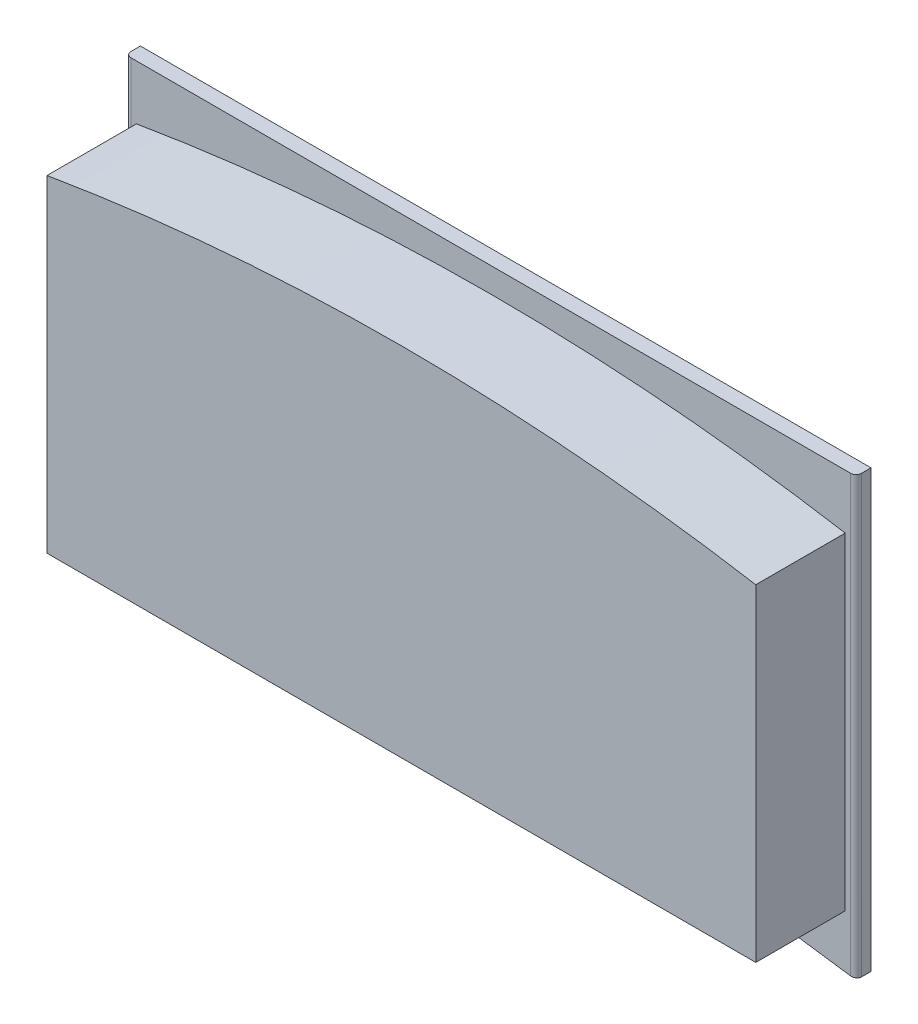
ISO-10303-21;
HEADER;
FILE_DESCRIPTION(('STEP AP214'),'2;1');
FILE_NAME('part.step','',(''),(''),'','','');
FILE_SCHEMA(('AUTOMOTIVE_DESIGN { 1 0 10303 214 1 1 1 1 }'));
ENDSEC;
DATA;
#1=APPLICATION_CONTEXT('core data for automotive mechanical design processes');
#2=APPLICATION_PROTOCOL_DEFINITION('international standard','automotive_design',2000,#1);
#3=PRODUCT_CONTEXT('',#1,'mechanical');
#4=PRODUCT('Part','Part','',(#3));
#5=PRODUCT_RELATED_PRODUCT_CATEGORY('part','',(#4));
#6=PRODUCT_DEFINITION_FORMATION('','',#4);
#7=PRODUCT_DEFINITION_CONTEXT('part definition',#1,'design');
#8=PRODUCT_DEFINITION('design','',#6,#7);
#9=PRODUCT_DEFINITION_SHAPE('','',#8);
#10=(LENGTH_UNIT() NAMED_UNIT(*) SI_UNIT(.MILLI.,.METRE.));
#11=(NAMED_UNIT(*) PLANE_ANGLE_UNIT() SI_UNIT($,.RADIAN.));
#12=(NAMED_UNIT(*) SI_UNIT($,.STERADIAN.) SOLID_ANGLE_UNIT());
#13=UNCERTAINTY_MEASURE_WITH_UNIT(LENGTH_MEASURE(1.E-05),#10,'distance_accuracy_value','');
#14=(GEOMETRIC_REPRESENTATION_CONTEXT(3) GLOBAL_UNCERTAINTY_ASSIGNED_CONTEXT((#13)) GLOBAL_UNIT_ASSIGNED_CONTEXT((#10,
#11,#12)) REPRESENTATION_CONTEXT('',''));
#15=CARTESIAN_POINT('',(0.,0.,0.));
#16=DIRECTION('',(0.,0.,1.));
#17=DIRECTION('',(1.,0.,0.));
#18=AXIS2_PLACEMENT_3D('',#15,#16,#17);
#19=CARTESIAN_POINT('',(-33.5,20.,1.36666666666667));
#20=DIRECTION('',(0.,-1.,0.));
#21=DIRECTION('',(1.,0.,0.));
#22=AXIS2_PLACEMENT_3D('',#19,#20,#21);
#23=PLANE('',#22);
#24=DIRECTION('',(-1.,0.,0.));
#25=VECTOR('',#24,1.);
#26=CARTESIAN_POINT('',(-33.5,20.,1.36666666666667));
#27=LINE('',#26,#25);
#28=CARTESIAN_POINT('',(33.,20.,1.36666666666667));
#29=VERTEX_POINT('',#28);
#30=CARTESIAN_POINT('',(-33.,20.,1.36666666666667));
#31=VERTEX_POINT('',#30);
#32=EDGE_CURVE('E157',#29,#31,#27,.T.);
#33=ORIENTED_EDGE('',*,*,#32,.F.);
#34=CARTESIAN_POINT('',(33.,20.,0.866666666666666));
#35=DIRECTION('',(0.,-1.,0.));
#36=DIRECTION('',(1.,0.,0.));
#37=AXIS2_PLACEMENT_3D('',#34,#35,#36);
#38=CIRCLE('',#37,0.5);
#39=CARTESIAN_POINT('',(33.5,20.,0.866666666666666));
#40=VERTEX_POINT('',#39);
#41=EDGE_CURVE('E190',#29,#40,#38,.F.);
#42=ORIENTED_EDGE('',*,*,#41,.T.);
#43=DIRECTION('',(0.,0.,-1.));
#44=VECTOR('',#43,1.);
#45=CARTESIAN_POINT('',(33.5,20.,1.36666666666667));
#46=LINE('',#45,#44);
#47=CARTESIAN_POINT('',(33.5,20.,0.));
#48=VERTEX_POINT('',#47);
#49=EDGE_CURVE('E164',#40,#48,#46,.T.);
#50=ORIENTED_EDGE('',*,*,#49,.T.);
#51=DIRECTION('',(-1.,0.,0.));
#52=VECTOR('',#51,1.);
#53=CARTESIAN_POINT('',(-33.5,20.,0.));
#54=LINE('',#53,#52);
#55=CARTESIAN_POINT('',(-33.5,20.,0.));
#56=VERTEX_POINT('',#55);
#57=EDGE_CURVE('E153',#48,#56,#54,.T.);
#58=ORIENTED_EDGE('',*,*,#57,.T.);
#59=DIRECTION('',(0.,0.,-1.));
#60=VECTOR('',#59,1.);
#61=CARTESIAN_POINT('',(-33.5,20.,1.36666666666667));
#62=LINE('',#61,#60);
#63=CARTESIAN_POINT('',(-33.5,20.,0.866666666666666));
#64=VERTEX_POINT('',#63);
#65=EDGE_CURVE('E180',#64,#56,#62,.T.);
#66=ORIENTED_EDGE('',*,*,#65,.F.);
#67=CARTESIAN_POINT('',(-33.,20.,0.866666666666666));
#68=DIRECTION('',(0.,-1.,0.));
#69=DIRECTION('',(1.,0.,0.));
#70=AXIS2_PLACEMENT_3D('',#67,#68,#69);
#71=CIRCLE('',#70,0.5);
#72=EDGE_CURVE('E188',#64,#31,#71,.F.);
#73=ORIENTED_EDGE('',*,*,#72,.T.);
#74=EDGE_LOOP('',(#33,#42,#50,#58,#66,#73));
#75=FACE_BOUND('',#74,.T.);
#76=ADVANCED_FACE('F36',(#75),#23,.F.);
#77=CARTESIAN_POINT('',(-33.5,20.,1.36666666666667));
#78=DIRECTION('',(1.,0.,0.));
#79=DIRECTION('',(0.,0.,-1.));
#80=AXIS2_PLACEMENT_3D('',#77,#78,#79);
#81=PLANE('',#80);
#82=DIRECTION('',(0.,0.,-1.));
#83=VECTOR('',#82,1.);
#84=CARTESIAN_POINT('',(-33.5,-20.,1.36666666666667));
#85=LINE('',#84,#83);
#86=CARTESIAN_POINT('',(-33.5,-20.,0.866666666666666));
#87=VERTEX_POINT('',#86);
#88=CARTESIAN_POINT('',(-33.5,-20.,0.));
#89=VERTEX_POINT('',#88);
#90=EDGE_CURVE('E178',#87,#89,#85,.T.);
#91=ORIENTED_EDGE('',*,*,#90,.F.);
#92=DIRECTION('',(0.,-1.,0.));
#93=VECTOR('',#92,1.);
#94=CARTESIAN_POINT('',(-33.5,20.,0.866666666666666));
#95=LINE('',#94,#93);
#96=EDGE_CURVE('E11',#87,#64,#95,.F.);
#97=ORIENTED_EDGE('',*,*,#96,.T.);
#98=ORIENTED_EDGE('',*,*,#65,.T.);
#99=DIRECTION('',(0.,-1.,0.));
#100=VECTOR('',#99,1.);
#101=CARTESIAN_POINT('',(-33.5,20.,0.));
#102=LINE('',#101,#100);
#103=EDGE_CURVE('E167',#56,#89,#102,.T.);
#104=ORIENTED_EDGE('',*,*,#103,.T.);
#105=EDGE_LOOP('',(#91,#97,#98,#104));
#106=FACE_BOUND('',#105,.T.);
#107=ADVANCED_FACE('F208',(#106),#81,.F.);
#108=CARTESIAN_POINT('',(0.,-237.434472887811,1.36666666666667));
#109=DIRECTION('',(0.,0.,-1.));
#110=DIRECTION('',(-1.,0.,0.));
#111=AXIS2_PLACEMENT_3D('',#108,#109,#110);
#112=CYLINDRICAL_SURFACE('',#111,220.);
#113=DIRECTION('',(0.,0.,-1.));
#114=VECTOR('',#113,1.);
#115=CARTESIAN_POINT('',(33.5,-20.,1.36666666666667));
#116=LINE('',#115,#114);
#117=CARTESIAN_POINT('',(33.5,-20.,0.866666666666666));
#118=VERTEX_POINT('',#117);
#119=CARTESIAN_POINT('',(33.5,-20.,0.));
#120=VERTEX_POINT('',#119);
#121=EDGE_CURVE('E176',#118,#120,#116,.T.);
#122=ORIENTED_EDGE('',*,*,#121,.F.);
#123=CARTESIAN_POINT('',(33.5,-20.,0.866666666666666));
#124=CARTESIAN_POINT('',(33.5000249589342,-20.0000039983039,0.894559501230496));
#125=CARTESIAN_POINT('',(33.4976675189293,-19.9996406382553,0.922443224294343));
#126=CARTESIAN_POINT('',(33.4883743582185,-19.9982090712921,0.977387654689915));
#127=CARTESIAN_POINT('',(33.4814437639934,-19.9971416536227,1.00444924813315));
#128=CARTESIAN_POINT('',(33.4631867227172,-19.9943312069324,1.05702010123214));
#129=CARTESIAN_POINT('',(33.4518586734638,-19.9925879316648,1.08252879116795));
#130=CARTESIAN_POINT('',(33.4251543111297,-19.9884813352237,1.13127121627492));
#131=CARTESIAN_POINT('',(33.409778328648,-19.986118064686,1.15450513701647));
#132=CARTESIAN_POINT('',(33.3753369398772,-19.9808291197986,1.19817788515446));
#133=CARTESIAN_POINT('',(33.3562529389205,-19.9779006114528,1.2186016999275));
#134=CARTESIAN_POINT('',(33.3149948089183,-19.9715759244639,1.25596470136937));
#135=CARTESIAN_POINT('',(33.2928200125786,-19.9681796448321,1.27290313359282));
#136=CARTESIAN_POINT('',(33.2457501480285,-19.960978710694,1.30301092808374));
#137=CARTESIAN_POINT('',(33.2208274583397,-19.957169917977,1.31613607129277));
#138=CARTESIAN_POINT('',(33.1691751892543,-19.9492860398946,1.33801099754405));
#139=CARTESIAN_POINT('',(33.142446387359,-19.9452110691394,1.34676264985061));
#140=CARTESIAN_POINT('',(33.0963234287435,-19.938188458615,1.35768469532813));
#141=CARTESIAN_POINT('',(33.0771976169219,-19.9352789292024,1.36105082261237));
#142=CARTESIAN_POINT('',(33.0387170847825,-19.9294302887209,1.36554168183552));
#143=CARTESIAN_POINT('',(33.0193627248747,-19.9264912250965,1.36666956449085));
#144=CARTESIAN_POINT('',(33.,-19.9235536216734,1.36666666666667));
#145=B_SPLINE_CURVE_WITH_KNOTS('',3,(#123,#124,#125,#126,#127,#128,#129,#130,#131,#132,#133,
#134,#135,#136,#137,#138,#139,#140,#141,#142,#143,#144),.UNSPECIFIED.,.F.,.F.,(4,2,2,2,2,2,2,2,
2,2,4),(0.,0.083563267422854,0.167033019658852,0.250533212487111,0.334026587877431,
0.417950000129661,0.501891559365854,0.586770850201522,0.671613831868495,0.730401438894563,
0.789106233328437),.UNSPECIFIED.);
#146=CARTESIAN_POINT('',(33.,-19.9235536216734,1.36666666666667));
#147=VERTEX_POINT('',#146);
#148=EDGE_CURVE('E45',#118,#147,#145,.T.);
#149=ORIENTED_EDGE('',*,*,#148,.T.);
#150=CARTESIAN_POINT('',(0.,-237.434472887811,1.36666666666667));
#151=DIRECTION('',(0.,0.,-1.));
#152=DIRECTION('',(-1.,0.,0.));
#153=AXIS2_PLACEMENT_3D('',#150,#151,#152);
#154=CIRCLE('',#153,220.);
#155=CARTESIAN_POINT('',(-33.,-19.9235536216734,1.36666666666667));
#156=VERTEX_POINT('',#155);
#157=EDGE_CURVE('E160',#156,#147,#154,.T.);
#158=ORIENTED_EDGE('',*,*,#157,.F.);
#159=CARTESIAN_POINT('',(-33.,-19.9235536216734,1.36666666666667));
#160=CARTESIAN_POINT('',(-33.0283709651002,-19.9278577468027,1.36668941570464));
#161=CARTESIAN_POINT('',(-33.0567356810366,-19.9321670343335,1.36425323953006));
#162=CARTESIAN_POINT('',(-33.1126518710774,-19.9406728380225,1.35462961715823));
#163=CARTESIAN_POINT('',(-33.1402037108191,-19.9448694048048,1.34744434225504));
#164=CARTESIAN_POINT('',(-33.1937364425937,-19.9530332153752,1.32848327075606));
#165=CARTESIAN_POINT('',(-33.2197164049979,-19.9570003233985,1.31670478774747));
#166=CARTESIAN_POINT('',(-33.2693320886797,-19.9645849240657,1.28888514266402));
#167=CARTESIAN_POINT('',(-33.2929684311854,-19.9682025093518,1.27284511437626));
#168=CARTESIAN_POINT('',(-33.3370957833991,-19.9749627671614,1.23703126666132));
#169=CARTESIAN_POINT('',(-33.3576021584496,-19.9781077584357,1.21727682483244));
#170=CARTESIAN_POINT('',(-33.3950053501275,-19.9838486610631,1.17452589880443));
#171=CARTESIAN_POINT('',(-33.4119015508058,-19.9864444787184,1.15152886247986));
#172=CARTESIAN_POINT('',(-33.441403532767,-19.9909796510911,1.10321651383583));
#173=CARTESIAN_POINT('',(-33.4540534138775,-19.9929257521586,1.07792873073053));
#174=CARTESIAN_POINT('',(-33.4749187659059,-19.9961369718641,1.02555415491055));
#175=CARTESIAN_POINT('',(-33.4831375784589,-19.9974026036675,0.998468735223223));
#176=CARTESIAN_POINT('',(-33.4926670659599,-19.9988703150925,0.953767548146718));
#177=CARTESIAN_POINT('',(-33.4954152964274,-19.9992936735915,0.9364522165764));
#178=CARTESIAN_POINT('',(-33.4990813593172,-19.9998584650527,0.901649440088261));
#179=CARTESIAN_POINT('',(-33.5000018053376,-20.0000003005721,0.884162276913341));
#180=CARTESIAN_POINT('',(-33.5,-20.,0.866666666666667));
#181=B_SPLINE_CURVE_WITH_KNOTS('',3,(#159,#160,#161,#162,#163,#164,#165,#166,#167,#168,#169,
#170,#171,#172,#173,#174,#175,#176,#177,#178,#179,#180),.UNSPECIFIED.,.F.,.F.,(4,2,2,2,2,2,2,2,
2,2,4),(0.,0.0859761877080472,0.17191309415806,0.257900337776049,0.343864727296562,
0.42939250587404,0.514934865126711,0.59955916024667,0.684119547421889,0.736640286060846,
0.789085869645676),.UNSPECIFIED.);
#182=EDGE_CURVE('E52',#156,#87,#181,.T.);
#183=ORIENTED_EDGE('',*,*,#182,.T.);
#184=ORIENTED_EDGE('',*,*,#90,.T.);
#185=CARTESIAN_POINT('',(0.,-237.434472887811,0.));
#186=DIRECTION('',(0.,0.,-1.));
#187=DIRECTION('',(-1.,0.,0.));
#188=AXIS2_PLACEMENT_3D('',#185,#186,#187);
#189=CIRCLE('',#188,220.);
#190=EDGE_CURVE('E170',#89,#120,#189,.T.);
#191=ORIENTED_EDGE('',*,*,#190,.T.);
#192=EDGE_LOOP('',(#122,#149,#158,#183,#184,#191));
#193=FACE_BOUND('',#192,.T.);
#194=ADVANCED_FACE('F202',(#193),#112,.F.);
#195=CARTESIAN_POINT('',(33.5,-20.,1.36666666666667));
#196=DIRECTION('',(-1.,0.,0.));
#197=DIRECTION('',(0.,-1.,0.));
#198=AXIS2_PLACEMENT_3D('',#195,#196,#197);
#199=PLANE('',#198);
#200=ORIENTED_EDGE('',*,*,#49,.F.);
#201=DIRECTION('',(0.,1.,0.));
#202=VECTOR('',#201,1.);
#203=CARTESIAN_POINT('',(33.5,-20.,0.866666666666666));
#204=LINE('',#203,#202);
#205=EDGE_CURVE('E60',#40,#118,#204,.F.);
#206=ORIENTED_EDGE('',*,*,#205,.T.);
#207=ORIENTED_EDGE('',*,*,#121,.T.);
#208=DIRECTION('',(0.,1.,0.));
#209=VECTOR('',#208,1.);
#210=CARTESIAN_POINT('',(33.5,-20.,0.));
#211=LINE('',#210,#209);
#212=EDGE_CURVE('E161',#120,#48,#211,.T.);
#213=ORIENTED_EDGE('',*,*,#212,.T.);
#214=EDGE_LOOP('',(#200,#206,#207,#213));
#215=FACE_BOUND('',#214,.T.);
#216=ADVANCED_FACE('F207',(#215),#199,.F.);
#217=CARTESIAN_POINT('',(0.,-237.434472887811,1.36666666666667));
#218=DIRECTION('',(0.,0.,-1.));
#219=DIRECTION('',(-1.,0.,0.));
#220=AXIS2_PLACEMENT_3D('',#217,#218,#219);
#221=PLANE('',#220);
#222=DIRECTION('',(-1.,0.,0.));
#223=VECTOR('',#222,1.);
#224=CARTESIAN_POINT('',(32.5,-15.,1.36666666666667));
#225=LINE('',#224,#223);
#226=CARTESIAN_POINT('',(32.5,-15.,1.36666666666667));
#227=VERTEX_POINT('',#226);
#228=CARTESIAN_POINT('',(-32.5,-15.,1.36666666666667));
#229=VERTEX_POINT('',#228);
#230=EDGE_CURVE('E139',#227,#229,#225,.T.);
#231=ORIENTED_EDGE('',*,*,#230,.T.);
#232=DIRECTION('',(0.,1.,0.));
#233=VECTOR('',#232,1.);
#234=CARTESIAN_POINT('',(-32.5,-15.,1.36666666666667));
#235=LINE('',#234,#233);
#236=CARTESIAN_POINT('',(-32.5,15.,1.36666666666667));
#237=VERTEX_POINT('',#236);
#238=EDGE_CURVE('E147',#229,#237,#235,.T.);
#239=ORIENTED_EDGE('',*,*,#238,.T.);
#240=CARTESIAN_POINT('',(0.,-177.272592950738,1.36666666666667));
#241=DIRECTION('',(0.,0.,-1.));
#242=DIRECTION('',(-1.,0.,0.));
#243=AXIS2_PLACEMENT_3D('',#240,#241,#242);
#244=CIRCLE('',#243,195.);
#245=CARTESIAN_POINT('',(32.5,15.,1.36666666666667));
#246=VERTEX_POINT('',#245);
#247=EDGE_CURVE('E119',#237,#246,#244,.T.);
#248=ORIENTED_EDGE('',*,*,#247,.T.);
#249=DIRECTION('',(0.,1.,0.));
#250=VECTOR('',#249,1.);
#251=CARTESIAN_POINT('',(32.5,-15.,1.36666666666667));
#252=LINE('',#251,#250);
#253=EDGE_CURVE('E142',#227,#246,#252,.T.);
#254=ORIENTED_EDGE('',*,*,#253,.F.);
#255=EDGE_LOOP('',(#231,#239,#248,#254));
#256=FACE_BOUND('',#255,.T.);
#257=ORIENTED_EDGE('',*,*,#157,.T.);
#258=DIRECTION('',(0.,1.,0.));
#259=VECTOR('',#258,1.);
#260=CARTESIAN_POINT('',(33.0000000000002,-237.43447288781,1.36666666666667));
#261=LINE('',#260,#259);
#262=EDGE_CURVE('E185',#147,#29,#261,.T.);
#263=ORIENTED_EDGE('',*,*,#262,.T.);
#264=ORIENTED_EDGE('',*,*,#32,.T.);
#265=DIRECTION('',(0.,-1.,0.));
#266=VECTOR('',#265,1.);
#267=CARTESIAN_POINT('',(-33.,-237.434472887811,1.36666666666667));
#268=LINE('',#267,#266);
#269=EDGE_CURVE('E182',#31,#156,#268,.T.);
#270=ORIENTED_EDGE('',*,*,#269,.T.);
#271=EDGE_LOOP('',(#257,#263,#264,#270));
#272=FACE_BOUND('',#271,.T.);
#273=ADVANCED_FACE('F229',(#256,#272),#221,.F.);
#274=CARTESIAN_POINT('',(0.,-237.434472887811,0.));
#275=DIRECTION('',(0.,0.,-1.));
#276=DIRECTION('',(-1.,0.,0.));
#277=AXIS2_PLACEMENT_3D('',#274,#275,#276);
#278=PLANE('',#277);
#279=ORIENTED_EDGE('',*,*,#57,.F.);
#280=ORIENTED_EDGE('',*,*,#212,.F.);
#281=ORIENTED_EDGE('',*,*,#190,.F.);
#282=ORIENTED_EDGE('',*,*,#103,.F.);
#283=EDGE_LOOP('',(#279,#280,#281,#282));
#284=FACE_BOUND('',#283,.T.);
#285=ADVANCED_FACE('F239',(#284),#278,.T.);
#286=CARTESIAN_POINT('',(-32.5,-15.,9.56666666666667));
#287=DIRECTION('',(-1.,0.,0.));
#288=DIRECTION('',(0.,0.,1.));
#289=AXIS2_PLACEMENT_3D('',#286,#287,#288);
#290=PLANE('',#289);
#291=ORIENTED_EDGE('',*,*,#238,.F.);
#292=DIRECTION('',(0.,0.,-1.));
#293=VECTOR('',#292,1.);
#294=CARTESIAN_POINT('',(-32.5,-15.,9.56666666666667));
#295=LINE('',#294,#293);
#296=CARTESIAN_POINT('',(-32.5,-15.,9.56666666666667));
#297=VERTEX_POINT('',#296);
#298=EDGE_CURVE('E138',#297,#229,#295,.T.);
#299=ORIENTED_EDGE('',*,*,#298,.F.);
#300=DIRECTION('',(0.,1.,0.));
#301=VECTOR('',#300,1.);
#302=CARTESIAN_POINT('',(-32.5,-15.,9.56666666666667));
#303=LINE('',#302,#301);
#304=CARTESIAN_POINT('',(-32.5,15.,9.56666666666667));
#305=VERTEX_POINT('',#304);
#306=EDGE_CURVE('E130',#297,#305,#303,.T.);
#307=ORIENTED_EDGE('',*,*,#306,.T.);
#308=DIRECTION('',(0.,0.,-1.));
#309=VECTOR('',#308,1.);
#310=CARTESIAN_POINT('',(-32.5,15.,9.56666666666667));
#311=LINE('',#310,#309);
#312=EDGE_CURVE('E114',#305,#237,#311,.T.);
#313=ORIENTED_EDGE('',*,*,#312,.T.);
#314=EDGE_LOOP('',(#291,#299,#307,#313));
#315=FACE_BOUND('',#314,.T.);
#316=ADVANCED_FACE('F136',(#315),#290,.T.);
#317=CARTESIAN_POINT('',(32.5,-15.,9.56666666666667));
#318=DIRECTION('',(0.,-1.,0.));
#319=DIRECTION('',(0.,0.,-1.));
#320=AXIS2_PLACEMENT_3D('',#317,#318,#319);
#321=PLANE('',#320);
#322=ORIENTED_EDGE('',*,*,#230,.F.);
#323=DIRECTION('',(0.,0.,-1.));
#324=VECTOR('',#323,1.);
#325=CARTESIAN_POINT('',(32.5,-15.,9.56666666666667));
#326=LINE('',#325,#324);
#327=CARTESIAN_POINT('',(32.5,-15.,9.56666666666667));
#328=VERTEX_POINT('',#327);
#329=EDGE_CURVE('E154',#328,#227,#326,.T.);
#330=ORIENTED_EDGE('',*,*,#329,.F.);
#331=DIRECTION('',(-1.,0.,0.));
#332=VECTOR('',#331,1.);
#333=CARTESIAN_POINT('',(32.5,-15.,9.56666666666667));
#334=LINE('',#333,#332);
#335=EDGE_CURVE('E124',#328,#297,#334,.T.);
#336=ORIENTED_EDGE('',*,*,#335,.T.);
#337=ORIENTED_EDGE('',*,*,#298,.T.);
#338=EDGE_LOOP('',(#322,#330,#336,#337));
#339=FACE_BOUND('',#338,.T.);
#340=ADVANCED_FACE('F253',(#339),#321,.T.);
#341=CARTESIAN_POINT('',(32.5,-15.,9.56666666666667));
#342=DIRECTION('',(-1.,0.,0.));
#343=DIRECTION('',(0.,0.,1.));
#344=AXIS2_PLACEMENT_3D('',#341,#342,#343);
#345=PLANE('',#344);
#346=ORIENTED_EDGE('',*,*,#253,.T.);
#347=DIRECTION('',(0.,0.,-1.));
#348=VECTOR('',#347,1.);
#349=CARTESIAN_POINT('',(32.5,15.,9.56666666666667));
#350=LINE('',#349,#348);
#351=CARTESIAN_POINT('',(32.5,15.,9.56666666666667));
#352=VERTEX_POINT('',#351);
#353=EDGE_CURVE('E123',#352,#246,#350,.T.);
#354=ORIENTED_EDGE('',*,*,#353,.F.);
#355=DIRECTION('',(0.,1.,0.));
#356=VECTOR('',#355,1.);
#357=CARTESIAN_POINT('',(32.5,-15.,9.56666666666667));
#358=LINE('',#357,#356);
#359=EDGE_CURVE('E133',#328,#352,#358,.T.);
#360=ORIENTED_EDGE('',*,*,#359,.F.);
#361=ORIENTED_EDGE('',*,*,#329,.T.);
#362=EDGE_LOOP('',(#346,#354,#360,#361));
#363=FACE_BOUND('',#362,.T.);
#364=ADVANCED_FACE('F256',(#363),#345,.F.);
#365=CARTESIAN_POINT('',(0.,-177.272592950738,9.56666666666667));
#366=DIRECTION('',(0.,0.,-1.));
#367=DIRECTION('',(-1.,0.,0.));
#368=AXIS2_PLACEMENT_3D('',#365,#366,#367);
#369=CYLINDRICAL_SURFACE('',#368,195.);
#370=ORIENTED_EDGE('',*,*,#247,.F.);
#371=ORIENTED_EDGE('',*,*,#312,.F.);
#372=CARTESIAN_POINT('',(0.,-177.272592950738,9.56666666666667));
#373=DIRECTION('',(0.,0.,-1.));
#374=DIRECTION('',(-1.,0.,0.));
#375=AXIS2_PLACEMENT_3D('',#372,#373,#374);
#376=CIRCLE('',#375,195.);
#377=EDGE_CURVE('E117',#305,#352,#376,.T.);
#378=ORIENTED_EDGE('',*,*,#377,.T.);
#379=ORIENTED_EDGE('',*,*,#353,.T.);
#380=EDGE_LOOP('',(#370,#371,#378,#379));
#381=FACE_BOUND('',#380,.T.);
#382=ADVANCED_FACE('F116',(#381),#369,.T.);
#383=CARTESIAN_POINT('',(0.,-177.272592950738,9.56666666666667));
#384=DIRECTION('',(0.,0.,-1.));
#385=DIRECTION('',(-1.,0.,0.));
#386=AXIS2_PLACEMENT_3D('',#383,#384,#385);
#387=PLANE('',#386);
#388=ORIENTED_EDGE('',*,*,#306,.F.);
#389=ORIENTED_EDGE('',*,*,#335,.F.);
#390=ORIENTED_EDGE('',*,*,#359,.T.);
#391=ORIENTED_EDGE('',*,*,#377,.F.);
#392=EDGE_LOOP('',(#388,#389,#390,#391));
#393=FACE_BOUND('',#392,.T.);
#394=ADVANCED_FACE('F128',(#393),#387,.F.);
#395=CARTESIAN_POINT('',(33.0000000000002,-237.43447288781,0.866666666666666));
#396=DIRECTION('',(0.,1.,0.));
#397=DIRECTION('',(-1.,0.,0.));
#398=AXIS2_PLACEMENT_3D('',#395,#396,#397);
#399=CYLINDRICAL_SURFACE('',#398,0.5);
#400=ORIENTED_EDGE('',*,*,#148,.F.);
#401=ORIENTED_EDGE('',*,*,#205,.F.);
#402=ORIENTED_EDGE('',*,*,#41,.F.);
#403=ORIENTED_EDGE('',*,*,#262,.F.);
#404=EDGE_LOOP('',(#400,#401,#402,#403));
#405=FACE_BOUND('',#404,.T.);
#406=ADVANCED_FACE('F216',(#405),#399,.T.);
#407=CARTESIAN_POINT('',(-33.,-237.434472887811,0.866666666666666));
#408=DIRECTION('',(0.,-1.,0.));
#409=DIRECTION('',(0.,0.,-1.));
#410=AXIS2_PLACEMENT_3D('',#407,#408,#409);
#411=CYLINDRICAL_SURFACE('',#410,0.5);
#412=ORIENTED_EDGE('',*,*,#72,.F.);
#413=ORIENTED_EDGE('',*,*,#96,.F.);
#414=ORIENTED_EDGE('',*,*,#182,.F.);
#415=ORIENTED_EDGE('',*,*,#269,.F.);
#416=EDGE_LOOP('',(#412,#413,#414,#415));
#417=FACE_BOUND('',#416,.T.);
#418=ADVANCED_FACE('F38',(#417),#411,.T.);
#419=CLOSED_SHELL('',(#76,#107,#194,#216,#273,#285,#316,#340,#364,#382,#394,#406,#418));
#420=MANIFOLD_SOLID_BREP('B2',#419);
#421=ADVANCED_BREP_SHAPE_REPRESENTATION('',(#18,#420),#14);
#422=SHAPE_DEFINITION_REPRESENTATION(#9,#421);
ENDSEC;
END-ISO-10303-21;
